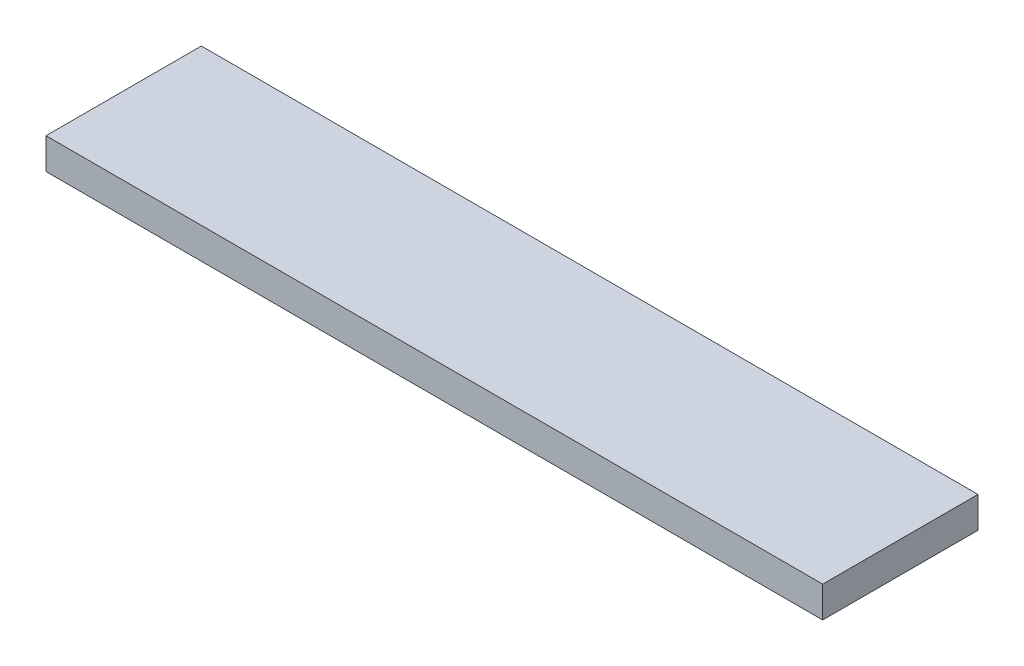
ISO-10303-21;
HEADER;
FILE_DESCRIPTION(('STEP AP214'),'2;1');
FILE_NAME('part.step','',(''),(''),'','','');
FILE_SCHEMA(('AUTOMOTIVE_DESIGN { 1 0 10303 214 1 1 1 1 }'));
ENDSEC;
DATA;
#1=APPLICATION_CONTEXT('core data for automotive mechanical design processes');
#2=APPLICATION_PROTOCOL_DEFINITION('international standard','automotive_design',2000,#1);
#3=PRODUCT_CONTEXT('',#1,'mechanical');
#4=PRODUCT('Part','Part','',(#3));
#5=PRODUCT_RELATED_PRODUCT_CATEGORY('part','',(#4));
#6=PRODUCT_DEFINITION_FORMATION('','',#4);
#7=PRODUCT_DEFINITION_CONTEXT('part definition',#1,'design');
#8=PRODUCT_DEFINITION('design','',#6,#7);
#9=PRODUCT_DEFINITION_SHAPE('','',#8);
#10=(LENGTH_UNIT() NAMED_UNIT(*) SI_UNIT(.MILLI.,.METRE.));
#11=(NAMED_UNIT(*) PLANE_ANGLE_UNIT() SI_UNIT($,.RADIAN.));
#12=(NAMED_UNIT(*) SI_UNIT($,.STERADIAN.) SOLID_ANGLE_UNIT());
#13=UNCERTAINTY_MEASURE_WITH_UNIT(LENGTH_MEASURE(1.E-05),#10,'distance_accuracy_value','');
#14=(GEOMETRIC_REPRESENTATION_CONTEXT(3) GLOBAL_UNCERTAINTY_ASSIGNED_CONTEXT((#13)) GLOBAL_UNIT_ASSIGNED_CONTEXT((#10,
#11,#12)) REPRESENTATION_CONTEXT('',''));
#15=CARTESIAN_POINT('',(0.,0.,0.));
#16=DIRECTION('',(0.,0.,1.));
#17=DIRECTION('',(1.,0.,0.));
#18=AXIS2_PLACEMENT_3D('',#15,#16,#17);
#19=CARTESIAN_POINT('',(-25.,-1.,10.));
#20=DIRECTION('',(1.,0.,0.));
#21=DIRECTION('',(0.,0.,-1.));
#22=AXIS2_PLACEMENT_3D('',#19,#20,#21);
#23=PLANE('',#22);
#24=DIRECTION('',(0.,-1.,0.));
#25=VECTOR('',#24,1.);
#26=CARTESIAN_POINT('',(-25.,-1.,0.));
#27=LINE('',#26,#25);
#28=CARTESIAN_POINT('',(-25.,0.999999999999997,0.));
#29=VERTEX_POINT('',#28);
#30=CARTESIAN_POINT('',(-25.,-1.,0.));
#31=VERTEX_POINT('',#30);
#32=EDGE_CURVE('E96',#29,#31,#27,.T.);
#33=ORIENTED_EDGE('',*,*,#32,.T.);
#34=DIRECTION('',(0.,0.,-1.));
#35=VECTOR('',#34,1.);
#36=CARTESIAN_POINT('',(-25.,-1.,10.));
#37=LINE('',#36,#35);
#38=CARTESIAN_POINT('',(-25.,-1.,10.));
#39=VERTEX_POINT('',#38);
#40=EDGE_CURVE('E11',#39,#31,#37,.T.);
#41=ORIENTED_EDGE('',*,*,#40,.F.);
#42=DIRECTION('',(0.,-1.,0.));
#43=VECTOR('',#42,1.);
#44=CARTESIAN_POINT('',(-25.,-1.,10.));
#45=LINE('',#44,#43);
#46=CARTESIAN_POINT('',(-25.,0.999999999999997,10.));
#47=VERTEX_POINT('',#46);
#48=EDGE_CURVE('E84',#47,#39,#45,.T.);
#49=ORIENTED_EDGE('',*,*,#48,.F.);
#50=DIRECTION('',(0.,0.,-1.));
#51=VECTOR('',#50,1.);
#52=CARTESIAN_POINT('',(-25.,0.999999999999997,10.));
#53=LINE('',#52,#51);
#54=EDGE_CURVE('E92',#47,#29,#53,.T.);
#55=ORIENTED_EDGE('',*,*,#54,.T.);
#56=EDGE_LOOP('',(#33,#41,#49,#55));
#57=FACE_BOUND('',#56,.T.);
#58=ADVANCED_FACE('F33',(#57),#23,.F.);
#59=CARTESIAN_POINT('',(25.,-0.999999999999996,10.));
#60=DIRECTION('',(0.,1.,0.));
#61=DIRECTION('',(-1.,0.,0.));
#62=AXIS2_PLACEMENT_3D('',#59,#60,#61);
#63=PLANE('',#62);
#64=DIRECTION('',(1.,0.,0.));
#65=VECTOR('',#64,1.);
#66=CARTESIAN_POINT('',(25.,-0.999999999999996,0.));
#67=LINE('',#66,#65);
#68=CARTESIAN_POINT('',(25.,-0.999999999999996,0.));
#69=VERTEX_POINT('',#68);
#70=EDGE_CURVE('E88',#31,#69,#67,.T.);
#71=ORIENTED_EDGE('',*,*,#70,.T.);
#72=DIRECTION('',(0.,0.,-1.));
#73=VECTOR('',#72,1.);
#74=CARTESIAN_POINT('',(25.,-0.999999999999996,10.));
#75=LINE('',#74,#73);
#76=CARTESIAN_POINT('',(25.,-0.999999999999996,10.));
#77=VERTEX_POINT('',#76);
#78=EDGE_CURVE('E41',#77,#69,#75,.T.);
#79=ORIENTED_EDGE('',*,*,#78,.F.);
#80=DIRECTION('',(1.,0.,0.));
#81=VECTOR('',#80,1.);
#82=CARTESIAN_POINT('',(25.,-0.999999999999996,10.));
#83=LINE('',#82,#81);
#84=EDGE_CURVE('E79',#39,#77,#83,.T.);
#85=ORIENTED_EDGE('',*,*,#84,.F.);
#86=ORIENTED_EDGE('',*,*,#40,.T.);
#87=EDGE_LOOP('',(#71,#79,#85,#86));
#88=FACE_BOUND('',#87,.T.);
#89=ADVANCED_FACE('F87',(#88),#63,.F.);
#90=CARTESIAN_POINT('',(25.,0.999999999999997,10.));
#91=DIRECTION('',(-1.,0.,0.));
#92=DIRECTION('',(0.,0.,1.));
#93=AXIS2_PLACEMENT_3D('',#90,#91,#92);
#94=PLANE('',#93);
#95=DIRECTION('',(0.,1.,0.));
#96=VECTOR('',#95,1.);
#97=CARTESIAN_POINT('',(25.,0.999999999999997,0.));
#98=LINE('',#97,#96);
#99=CARTESIAN_POINT('',(25.,0.999999999999997,0.));
#100=VERTEX_POINT('',#99);
#101=EDGE_CURVE('E66',#69,#100,#98,.T.);
#102=ORIENTED_EDGE('',*,*,#101,.T.);
#103=DIRECTION('',(0.,0.,-1.));
#104=VECTOR('',#103,1.);
#105=CARTESIAN_POINT('',(25.,0.999999999999997,10.));
#106=LINE('',#105,#104);
#107=CARTESIAN_POINT('',(25.,0.999999999999997,10.));
#108=VERTEX_POINT('',#107);
#109=EDGE_CURVE('E89',#108,#100,#106,.T.);
#110=ORIENTED_EDGE('',*,*,#109,.F.);
#111=DIRECTION('',(0.,1.,0.));
#112=VECTOR('',#111,1.);
#113=CARTESIAN_POINT('',(25.,0.999999999999997,10.));
#114=LINE('',#113,#112);
#115=EDGE_CURVE('E82',#77,#108,#114,.T.);
#116=ORIENTED_EDGE('',*,*,#115,.F.);
#117=ORIENTED_EDGE('',*,*,#78,.T.);
#118=EDGE_LOOP('',(#102,#110,#116,#117));
#119=FACE_BOUND('',#118,.T.);
#120=ADVANCED_FACE('F90',(#119),#94,.F.);
#121=CARTESIAN_POINT('',(-25.,0.999999999999997,10.));
#122=DIRECTION('',(0.,-1.,0.));
#123=DIRECTION('',(0.,0.,-1.));
#124=AXIS2_PLACEMENT_3D('',#121,#122,#123);
#125=PLANE('',#124);
#126=DIRECTION('',(-1.,0.,0.));
#127=VECTOR('',#126,1.);
#128=CARTESIAN_POINT('',(-25.,0.999999999999997,0.));
#129=LINE('',#128,#127);
#130=EDGE_CURVE('E72',#100,#29,#129,.T.);
#131=ORIENTED_EDGE('',*,*,#130,.T.);
#132=ORIENTED_EDGE('',*,*,#54,.F.);
#133=DIRECTION('',(-1.,0.,0.));
#134=VECTOR('',#133,1.);
#135=CARTESIAN_POINT('',(-25.,0.999999999999997,10.));
#136=LINE('',#135,#134);
#137=EDGE_CURVE('E49',#108,#47,#136,.T.);
#138=ORIENTED_EDGE('',*,*,#137,.F.);
#139=ORIENTED_EDGE('',*,*,#109,.T.);
#140=EDGE_LOOP('',(#131,#132,#138,#139));
#141=FACE_BOUND('',#140,.T.);
#142=ADVANCED_FACE('F103',(#141),#125,.F.);
#143=CARTESIAN_POINT('',(0.,0.,10.));
#144=DIRECTION('',(0.,0.,-1.));
#145=DIRECTION('',(-1.,0.,0.));
#146=AXIS2_PLACEMENT_3D('',#143,#144,#145);
#147=PLANE('',#146);
#148=ORIENTED_EDGE('',*,*,#48,.T.);
#149=ORIENTED_EDGE('',*,*,#84,.T.);
#150=ORIENTED_EDGE('',*,*,#115,.T.);
#151=ORIENTED_EDGE('',*,*,#137,.T.);
#152=EDGE_LOOP('',(#148,#149,#150,#151));
#153=FACE_BOUND('',#152,.T.);
#154=ADVANCED_FACE('F80',(#153),#147,.F.);
#155=CARTESIAN_POINT('',(0.,0.,0.));
#156=DIRECTION('',(0.,0.,-1.));
#157=DIRECTION('',(-1.,0.,0.));
#158=AXIS2_PLACEMENT_3D('',#155,#156,#157);
#159=PLANE('',#158);
#160=ORIENTED_EDGE('',*,*,#32,.F.);
#161=ORIENTED_EDGE('',*,*,#130,.F.);
#162=ORIENTED_EDGE('',*,*,#101,.F.);
#163=ORIENTED_EDGE('',*,*,#70,.F.);
#164=EDGE_LOOP('',(#160,#161,#162,#163));
#165=FACE_BOUND('',#164,.T.);
#166=ADVANCED_FACE('F106',(#165),#159,.T.);
#167=CLOSED_SHELL('',(#58,#89,#120,#142,#154,#166));
#168=MANIFOLD_SOLID_BREP('B2',#167);
#169=ADVANCED_BREP_SHAPE_REPRESENTATION('',(#18,#168),#14);
#170=SHAPE_DEFINITION_REPRESENTATION(#9,#169);
ENDSEC;
END-ISO-10303-21;
